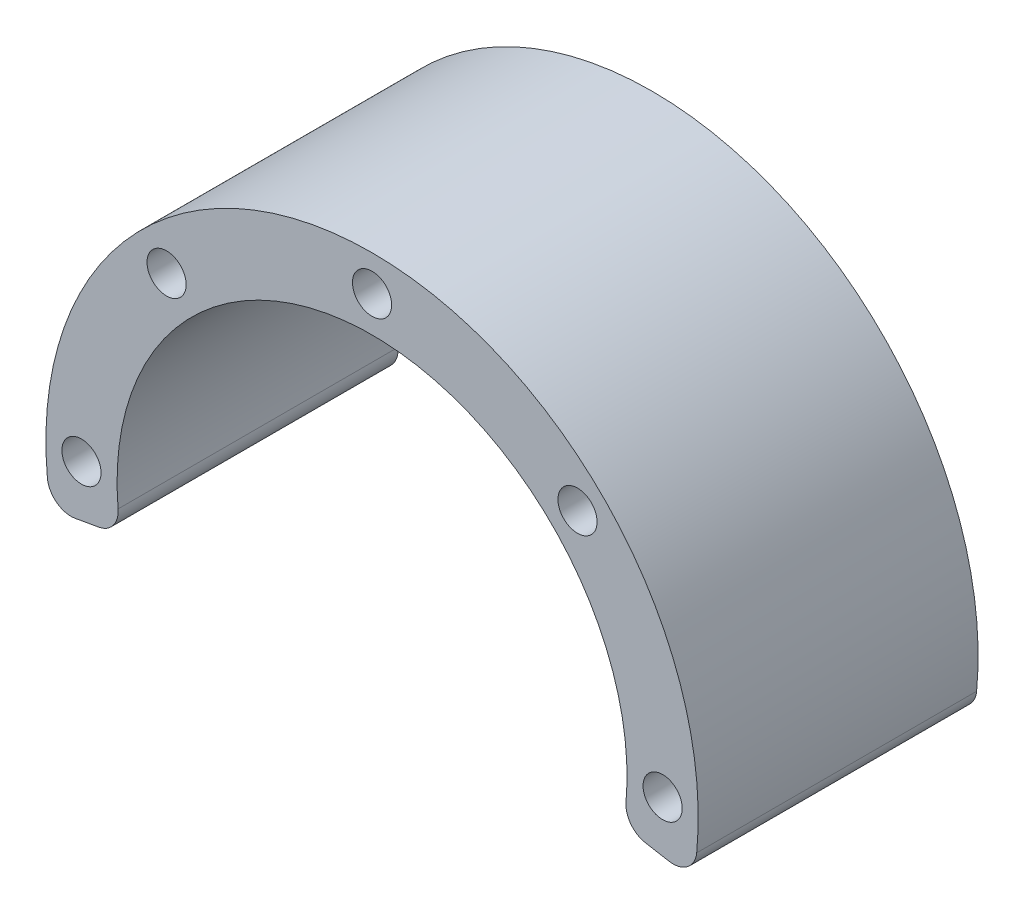
ISO-10303-21;
HEADER;
FILE_DESCRIPTION(('STEP AP214'),'2;1');
FILE_NAME('part.step','',(''),(''),'','','');
FILE_SCHEMA(('AUTOMOTIVE_DESIGN { 1 0 10303 214 1 1 1 1 }'));
ENDSEC;
DATA;
#1=APPLICATION_CONTEXT('core data for automotive mechanical design processes');
#2=APPLICATION_PROTOCOL_DEFINITION('international standard','automotive_design',2000,#1);
#3=PRODUCT_CONTEXT('',#1,'mechanical');
#4=PRODUCT('Part','Part','',(#3));
#5=PRODUCT_RELATED_PRODUCT_CATEGORY('part','',(#4));
#6=PRODUCT_DEFINITION_FORMATION('','',#4);
#7=PRODUCT_DEFINITION_CONTEXT('part definition',#1,'design');
#8=PRODUCT_DEFINITION('design','',#6,#7);
#9=PRODUCT_DEFINITION_SHAPE('','',#8);
#10=(LENGTH_UNIT() NAMED_UNIT(*) SI_UNIT(.MILLI.,.METRE.));
#11=(NAMED_UNIT(*) PLANE_ANGLE_UNIT() SI_UNIT($,.RADIAN.));
#12=(NAMED_UNIT(*) SI_UNIT($,.STERADIAN.) SOLID_ANGLE_UNIT());
#13=UNCERTAINTY_MEASURE_WITH_UNIT(LENGTH_MEASURE(1.E-05),#10,'distance_accuracy_value','');
#14=(GEOMETRIC_REPRESENTATION_CONTEXT(3) GLOBAL_UNCERTAINTY_ASSIGNED_CONTEXT((#13)) GLOBAL_UNIT_ASSIGNED_CONTEXT((#10,
#11,#12)) REPRESENTATION_CONTEXT('',''));
#15=CARTESIAN_POINT('',(0.,0.,0.));
#16=DIRECTION('',(0.,0.,1.));
#17=DIRECTION('',(1.,0.,0.));
#18=AXIS2_PLACEMENT_3D('',#15,#16,#17);
#19=CARTESIAN_POINT('',(0.,0.,0.));
#20=DIRECTION('',(0.,0.,1.));
#21=DIRECTION('',(1.,0.,0.));
#22=AXIS2_PLACEMENT_3D('',#19,#20,#21);
#23=PLANE('',#22);
#24=CARTESIAN_POINT('',(0.,24.5,0.));
#25=DIRECTION('',(0.,0.,1.));
#26=DIRECTION('',(1.,0.,0.));
#27=AXIS2_PLACEMENT_3D('',#24,#25,#26);
#28=CIRCLE('',#27,1.65);
#29=CARTESIAN_POINT('',(1.65,24.5,0.));
#30=VERTEX_POINT('',#29);
#31=EDGE_CURVE('E178',#30,#30,#28,.T.);
#32=ORIENTED_EDGE('',*,*,#31,.T.);
#33=EDGE_LOOP('',(#32));
#34=FACE_BOUND('',#33,.T.);
#35=CARTESIAN_POINT('',(17.3241161390707,17.3241161390701,0.));
#36=DIRECTION('',(0.,0.,1.));
#37=DIRECTION('',(1.,0.,0.));
#38=AXIS2_PLACEMENT_3D('',#35,#36,#37);
#39=CIRCLE('',#38,1.65);
#40=CARTESIAN_POINT('',(18.9741161390707,17.3241161390701,0.));
#41=VERTEX_POINT('',#40);
#42=EDGE_CURVE('E183',#41,#41,#39,.T.);
#43=ORIENTED_EDGE('',*,*,#42,.T.);
#44=EDGE_LOOP('',(#43));
#45=FACE_BOUND('',#44,.T.);
#46=CARTESIAN_POINT('',(24.5,-4.31946145518225E-13,0.));
#47=DIRECTION('',(0.,0.,1.));
#48=DIRECTION('',(1.,0.,0.));
#49=AXIS2_PLACEMENT_3D('',#46,#47,#48);
#50=CIRCLE('',#49,1.65);
#51=CARTESIAN_POINT('',(26.15,-4.31946145518225E-13,0.));
#52=VERTEX_POINT('',#51);
#53=EDGE_CURVE('E187',#52,#52,#50,.T.);
#54=ORIENTED_EDGE('',*,*,#53,.T.);
#55=EDGE_LOOP('',(#54));
#56=FACE_BOUND('',#55,.T.);
#57=CARTESIAN_POINT('',(-24.5,0.,0.));
#58=DIRECTION('',(0.,0.,1.));
#59=DIRECTION('',(1.,0.,0.));
#60=AXIS2_PLACEMENT_3D('',#57,#58,#59);
#61=CIRCLE('',#60,1.65);
#62=CARTESIAN_POINT('',(-22.85,0.,0.));
#63=VERTEX_POINT('',#62);
#64=EDGE_CURVE('E191',#63,#63,#61,.T.);
#65=ORIENTED_EDGE('',*,*,#64,.T.);
#66=EDGE_LOOP('',(#65));
#67=FACE_BOUND('',#66,.T.);
#68=CARTESIAN_POINT('',(-17.3241161390702,17.3241161390706,0.));
#69=DIRECTION('',(0.,0.,1.));
#70=DIRECTION('',(1.,0.,0.));
#71=AXIS2_PLACEMENT_3D('',#68,#69,#70);
#72=CIRCLE('',#71,1.65);
#73=CARTESIAN_POINT('',(-15.6741161390702,17.3241161390706,0.));
#74=VERTEX_POINT('',#73);
#75=EDGE_CURVE('E195',#74,#74,#72,.T.);
#76=ORIENTED_EDGE('',*,*,#75,.T.);
#77=EDGE_LOOP('',(#76));
#78=FACE_BOUND('',#77,.T.);
#79=CARTESIAN_POINT('',(0.,0.,0.));
#80=DIRECTION('',(0.,0.,1.));
#81=DIRECTION('',(1.,0.,0.));
#82=AXIS2_PLACEMENT_3D('',#79,#80,#81);
#83=CIRCLE('',#82,27.5);
#84=CARTESIAN_POINT('',(27.3733221470456,-2.63651941659133,0.));
#85=VERTEX_POINT('',#84);
#86=CARTESIAN_POINT('',(-27.3733221470456,-2.63651941659133,0.));
#87=VERTEX_POINT('',#86);
#88=EDGE_CURVE('E182',#85,#87,#83,.T.);
#89=ORIENTED_EDGE('',*,*,#88,.F.);
#90=CARTESIAN_POINT('',(25.3825350818059,-2.44477254993014,0.));
#91=DIRECTION('',(0.,0.,1.));
#92=DIRECTION('',(1.,0.,0.));
#93=AXIS2_PLACEMENT_3D('',#90,#91,#92);
#94=CIRCLE('',#93,2.);
#95=CARTESIAN_POINT('',(25.0352387264721,-4.41438805595456,0.));
#96=VERTEX_POINT('',#95);
#97=EDGE_CURVE('E225',#85,#96,#94,.F.);
#98=ORIENTED_EDGE('',*,*,#97,.T.);
#99=DIRECTION('',(-0.984807753012207,0.173648177666934,0.));
#100=VECTOR('',#99,1.);
#101=CARTESIAN_POINT('',(21.1733666897625,-3.73343581983909,0.));
#102=LINE('',#101,#100);
#103=CARTESIAN_POINT('',(23.0590164506845,-4.06592674885611,0.));
#104=VERTEX_POINT('',#103);
#105=EDGE_CURVE('E132',#96,#104,#102,.T.);
#106=ORIENTED_EDGE('',*,*,#105,.T.);
#107=CARTESIAN_POINT('',(23.4063128060183,-2.0963112428317,0.));
#108=DIRECTION('',(0.,0.,1.));
#109=DIRECTION('',(1.,0.,0.));
#110=AXIS2_PLACEMENT_3D('',#107,#108,#109);
#111=CIRCLE('',#110,2.);
#112=CARTESIAN_POINT('',(21.4142861842295,-1.91790177535666,0.));
#113=VERTEX_POINT('',#112);
#114=EDGE_CURVE('E217',#104,#113,#111,.F.);
#115=ORIENTED_EDGE('',*,*,#114,.T.);
#116=CARTESIAN_POINT('',(0.,0.,0.));
#117=DIRECTION('',(0.,0.,1.));
#118=DIRECTION('',(1.,0.,0.));
#119=AXIS2_PLACEMENT_3D('',#116,#117,#118);
#120=CIRCLE('',#119,21.5);
#121=CARTESIAN_POINT('',(-21.4142861842295,-1.91790177535666,0.));
#122=VERTEX_POINT('',#121);
#123=EDGE_CURVE('E177',#113,#122,#120,.T.);
#124=ORIENTED_EDGE('',*,*,#123,.T.);
#125=CARTESIAN_POINT('',(-23.4063128060183,-2.0963112428317,0.));
#126=DIRECTION('',(0.,0.,1.));
#127=DIRECTION('',(1.,0.,0.));
#128=AXIS2_PLACEMENT_3D('',#125,#126,#127);
#129=CIRCLE('',#128,2.);
#130=CARTESIAN_POINT('',(-23.0590164506845,-4.06592674885611,0.));
#131=VERTEX_POINT('',#130);
#132=EDGE_CURVE('E67',#122,#131,#129,.F.);
#133=ORIENTED_EDGE('',*,*,#132,.T.);
#134=DIRECTION('',(-0.984807753012207,-0.173648177666934,0.));
#135=VECTOR('',#134,1.);
#136=CARTESIAN_POINT('',(-21.1733666897625,-3.73343581983909,0.));
#137=LINE('',#136,#135);
#138=CARTESIAN_POINT('',(-25.0352387264721,-4.41438805595456,0.));
#139=VERTEX_POINT('',#138);
#140=EDGE_CURVE('E148',#131,#139,#137,.T.);
#141=ORIENTED_EDGE('',*,*,#140,.T.);
#142=CARTESIAN_POINT('',(-25.3825350818059,-2.44477254993014,0.));
#143=DIRECTION('',(0.,0.,1.));
#144=DIRECTION('',(1.,0.,0.));
#145=AXIS2_PLACEMENT_3D('',#142,#143,#144);
#146=CIRCLE('',#145,2.);
#147=EDGE_CURVE('E222',#139,#87,#146,.F.);
#148=ORIENTED_EDGE('',*,*,#147,.T.);
#149=EDGE_LOOP('',(#89,#98,#106,#115,#124,#133,#141,#148));
#150=FACE_BOUND('',#149,.T.);
#151=ADVANCED_FACE('F44',(#34,#45,#56,#67,#78,#150),#23,.F.);
#152=CARTESIAN_POINT('',(0.,0.,2.));
#153=DIRECTION('',(0.,0.,-1.));
#154=DIRECTION('',(-1.,0.,0.));
#155=AXIS2_PLACEMENT_3D('',#152,#153,#154);
#156=CYLINDRICAL_SURFACE('',#155,27.5);
#157=CARTESIAN_POINT('',(0.,0.,23.6));
#158=DIRECTION('',(0.,0.,-1.));
#159=DIRECTION('',(-1.,0.,0.));
#160=AXIS2_PLACEMENT_3D('',#157,#158,#159);
#161=CIRCLE('',#160,27.5);
#162=CARTESIAN_POINT('',(-27.3733221470456,-2.63651941659133,23.6));
#163=VERTEX_POINT('',#162);
#164=CARTESIAN_POINT('',(27.3733221470456,-2.63651941659133,23.6));
#165=VERTEX_POINT('',#164);
#166=EDGE_CURVE('E174',#163,#165,#161,.T.);
#167=ORIENTED_EDGE('',*,*,#166,.T.);
#168=DIRECTION('',(0.,0.,-1.));
#169=VECTOR('',#168,1.);
#170=CARTESIAN_POINT('',(27.3733221470456,-2.63651941659133,2.));
#171=LINE('',#170,#169);
#172=EDGE_CURVE('E116',#165,#85,#171,.T.);
#173=ORIENTED_EDGE('',*,*,#172,.T.);
#174=ORIENTED_EDGE('',*,*,#88,.T.);
#175=DIRECTION('',(0.,0.,-1.));
#176=VECTOR('',#175,1.);
#177=CARTESIAN_POINT('',(-27.3733221470456,-2.63651941659133,2.));
#178=LINE('',#177,#176);
#179=EDGE_CURVE('E122',#87,#163,#178,.F.);
#180=ORIENTED_EDGE('',*,*,#179,.T.);
#181=EDGE_LOOP('',(#167,#173,#174,#180));
#182=FACE_BOUND('',#181,.T.);
#183=ADVANCED_FACE('F257',(#182),#156,.T.);
#184=CARTESIAN_POINT('',(-17.3241161390702,17.3241161390706,0.));
#185=DIRECTION('',(0.,0.,1.));
#186=DIRECTION('',(1.,0.,0.));
#187=AXIS2_PLACEMENT_3D('',#184,#185,#186);
#188=CYLINDRICAL_SURFACE('',#187,1.65);
#189=ORIENTED_EDGE('',*,*,#75,.F.);
#190=EDGE_LOOP('',(#189));
#191=FACE_BOUND('',#190,.T.);
#192=CARTESIAN_POINT('',(-17.3241161390702,17.3241161390706,23.6));
#193=DIRECTION('',(0.,0.,-1.));
#194=DIRECTION('',(-1.,0.,0.));
#195=AXIS2_PLACEMENT_3D('',#192,#193,#194);
#196=CIRCLE('',#195,1.65);
#197=CARTESIAN_POINT('',(-18.9741161390702,17.3241161390706,23.6));
#198=VERTEX_POINT('',#197);
#199=EDGE_CURVE('E166',#198,#198,#196,.T.);
#200=ORIENTED_EDGE('',*,*,#199,.F.);
#201=EDGE_LOOP('',(#200));
#202=FACE_BOUND('',#201,.T.);
#203=ADVANCED_FACE('F263',(#191,#202),#188,.F.);
#204=CARTESIAN_POINT('',(-24.5,0.,0.));
#205=DIRECTION('',(0.,0.,1.));
#206=DIRECTION('',(1.,0.,0.));
#207=AXIS2_PLACEMENT_3D('',#204,#205,#206);
#208=CYLINDRICAL_SURFACE('',#207,1.65);
#209=ORIENTED_EDGE('',*,*,#64,.F.);
#210=EDGE_LOOP('',(#209));
#211=FACE_BOUND('',#210,.T.);
#212=CARTESIAN_POINT('',(-24.5,0.,23.6));
#213=DIRECTION('',(0.,0.,-1.));
#214=DIRECTION('',(-1.,0.,0.));
#215=AXIS2_PLACEMENT_3D('',#212,#213,#214);
#216=CIRCLE('',#215,1.65);
#217=CARTESIAN_POINT('',(-26.15,0.,23.6));
#218=VERTEX_POINT('',#217);
#219=EDGE_CURVE('E162',#218,#218,#216,.T.);
#220=ORIENTED_EDGE('',*,*,#219,.F.);
#221=EDGE_LOOP('',(#220));
#222=FACE_BOUND('',#221,.T.);
#223=ADVANCED_FACE('F374',(#211,#222),#208,.F.);
#224=CARTESIAN_POINT('',(24.5,-4.31946145518225E-13,0.));
#225=DIRECTION('',(0.,0.,1.));
#226=DIRECTION('',(1.,0.,0.));
#227=AXIS2_PLACEMENT_3D('',#224,#225,#226);
#228=CYLINDRICAL_SURFACE('',#227,1.65);
#229=ORIENTED_EDGE('',*,*,#53,.F.);
#230=EDGE_LOOP('',(#229));
#231=FACE_BOUND('',#230,.T.);
#232=CARTESIAN_POINT('',(24.5,-4.31946145518225E-13,23.6));
#233=DIRECTION('',(0.,0.,-1.));
#234=DIRECTION('',(-1.,0.,0.));
#235=AXIS2_PLACEMENT_3D('',#232,#233,#234);
#236=CIRCLE('',#235,1.65);
#237=CARTESIAN_POINT('',(22.85,-4.31946145518225E-13,23.6));
#238=VERTEX_POINT('',#237);
#239=EDGE_CURVE('E158',#238,#238,#236,.T.);
#240=ORIENTED_EDGE('',*,*,#239,.F.);
#241=EDGE_LOOP('',(#240));
#242=FACE_BOUND('',#241,.T.);
#243=ADVANCED_FACE('F361',(#231,#242),#228,.F.);
#244=CARTESIAN_POINT('',(17.3241161390707,17.3241161390701,0.));
#245=DIRECTION('',(0.,0.,1.));
#246=DIRECTION('',(1.,0.,0.));
#247=AXIS2_PLACEMENT_3D('',#244,#245,#246);
#248=CYLINDRICAL_SURFACE('',#247,1.65);
#249=ORIENTED_EDGE('',*,*,#42,.F.);
#250=EDGE_LOOP('',(#249));
#251=FACE_BOUND('',#250,.T.);
#252=CARTESIAN_POINT('',(17.3241161390707,17.3241161390701,23.6));
#253=DIRECTION('',(0.,0.,-1.));
#254=DIRECTION('',(-1.,0.,0.));
#255=AXIS2_PLACEMENT_3D('',#252,#253,#254);
#256=CIRCLE('',#255,1.65);
#257=CARTESIAN_POINT('',(15.6741161390707,17.3241161390701,23.6));
#258=VERTEX_POINT('',#257);
#259=EDGE_CURVE('E151',#258,#258,#256,.T.);
#260=ORIENTED_EDGE('',*,*,#259,.F.);
#261=EDGE_LOOP('',(#260));
#262=FACE_BOUND('',#261,.T.);
#263=ADVANCED_FACE('F347',(#251,#262),#248,.F.);
#264=CARTESIAN_POINT('',(0.,24.5,0.));
#265=DIRECTION('',(0.,0.,1.));
#266=DIRECTION('',(1.,0.,0.));
#267=AXIS2_PLACEMENT_3D('',#264,#265,#266);
#268=CYLINDRICAL_SURFACE('',#267,1.65);
#269=ORIENTED_EDGE('',*,*,#31,.F.);
#270=EDGE_LOOP('',(#269));
#271=FACE_BOUND('',#270,.T.);
#272=CARTESIAN_POINT('',(0.,24.5,23.6));
#273=DIRECTION('',(0.,0.,-1.));
#274=DIRECTION('',(-1.,0.,0.));
#275=AXIS2_PLACEMENT_3D('',#272,#273,#274);
#276=CIRCLE('',#275,1.65);
#277=CARTESIAN_POINT('',(-1.65,24.5,23.6));
#278=VERTEX_POINT('',#277);
#279=EDGE_CURVE('E170',#278,#278,#276,.T.);
#280=ORIENTED_EDGE('',*,*,#279,.F.);
#281=EDGE_LOOP('',(#280));
#282=FACE_BOUND('',#281,.T.);
#283=ADVANCED_FACE('F333',(#271,#282),#268,.F.);
#284=CARTESIAN_POINT('',(0.,0.,-8.));
#285=DIRECTION('',(0.,0.,1.));
#286=DIRECTION('',(1.,0.,0.));
#287=AXIS2_PLACEMENT_3D('',#284,#285,#286);
#288=CYLINDRICAL_SURFACE('',#287,21.5);
#289=CARTESIAN_POINT('',(0.,0.,23.6));
#290=DIRECTION('',(0.,0.,-1.));
#291=DIRECTION('',(-1.,0.,0.));
#292=AXIS2_PLACEMENT_3D('',#289,#290,#291);
#293=CIRCLE('',#292,21.5);
#294=CARTESIAN_POINT('',(-21.4142861842295,-1.91790177535666,23.6));
#295=VERTEX_POINT('',#294);
#296=CARTESIAN_POINT('',(21.4142861842295,-1.91790177535666,23.6));
#297=VERTEX_POINT('',#296);
#298=EDGE_CURVE('E155',#295,#297,#293,.T.);
#299=ORIENTED_EDGE('',*,*,#298,.F.);
#300=DIRECTION('',(0.,0.,1.));
#301=VECTOR('',#300,1.);
#302=CARTESIAN_POINT('',(-21.4142861842295,-1.91790177535666,-8.));
#303=LINE('',#302,#301);
#304=EDGE_CURVE('E11',#295,#122,#303,.F.);
#305=ORIENTED_EDGE('',*,*,#304,.T.);
#306=ORIENTED_EDGE('',*,*,#123,.F.);
#307=DIRECTION('',(0.,0.,1.));
#308=VECTOR('',#307,1.);
#309=CARTESIAN_POINT('',(21.4142861842295,-1.91790177535666,-8.));
#310=LINE('',#309,#308);
#311=EDGE_CURVE('E53',#113,#297,#310,.T.);
#312=ORIENTED_EDGE('',*,*,#311,.T.);
#313=EDGE_LOOP('',(#299,#305,#306,#312));
#314=FACE_BOUND('',#313,.T.);
#315=ADVANCED_FACE('F238',(#314),#288,.F.);
#316=CARTESIAN_POINT('',(0.,0.,23.6));
#317=DIRECTION('',(0.,0.,-1.));
#318=DIRECTION('',(-1.,0.,0.));
#319=AXIS2_PLACEMENT_3D('',#316,#317,#318);
#320=PLANE('',#319);
#321=ORIENTED_EDGE('',*,*,#259,.T.);
#322=EDGE_LOOP('',(#321));
#323=FACE_BOUND('',#322,.T.);
#324=DIRECTION('',(-0.984807753012207,0.173648177666934,0.));
#325=VECTOR('',#324,1.);
#326=CARTESIAN_POINT('',(21.1733666897625,-3.73343581983909,23.6));
#327=LINE('',#326,#325);
#328=CARTESIAN_POINT('',(25.0352387264721,-4.41438805595456,23.6));
#329=VERTEX_POINT('',#328);
#330=CARTESIAN_POINT('',(23.0590164506845,-4.06592674885611,23.6));
#331=VERTEX_POINT('',#330);
#332=EDGE_CURVE('E129',#329,#331,#327,.T.);
#333=ORIENTED_EDGE('',*,*,#332,.F.);
#334=CARTESIAN_POINT('',(25.3825350818059,-2.44477254993014,23.6));
#335=DIRECTION('',(0.,0.,-1.));
#336=DIRECTION('',(-1.,0.,0.));
#337=AXIS2_PLACEMENT_3D('',#334,#335,#336);
#338=CIRCLE('',#337,2.);
#339=EDGE_CURVE('E111',#329,#165,#338,.F.);
#340=ORIENTED_EDGE('',*,*,#339,.T.);
#341=ORIENTED_EDGE('',*,*,#166,.F.);
#342=CARTESIAN_POINT('',(-25.3825350818059,-2.44477254993014,23.6));
#343=DIRECTION('',(0.,0.,-1.));
#344=DIRECTION('',(-1.,0.,0.));
#345=AXIS2_PLACEMENT_3D('',#342,#343,#344);
#346=CIRCLE('',#345,2.);
#347=CARTESIAN_POINT('',(-25.0352387264721,-4.41438805595456,23.6));
#348=VERTEX_POINT('',#347);
#349=EDGE_CURVE('E123',#163,#348,#346,.F.);
#350=ORIENTED_EDGE('',*,*,#349,.T.);
#351=DIRECTION('',(-0.984807753012207,-0.173648177666934,0.));
#352=VECTOR('',#351,1.);
#353=CARTESIAN_POINT('',(-21.1733666897625,-3.73343581983909,23.6));
#354=LINE('',#353,#352);
#355=CARTESIAN_POINT('',(-23.0590164506845,-4.06592674885611,23.6));
#356=VERTEX_POINT('',#355);
#357=EDGE_CURVE('E141',#356,#348,#354,.T.);
#358=ORIENTED_EDGE('',*,*,#357,.F.);
#359=CARTESIAN_POINT('',(-23.4063128060183,-2.0963112428317,23.6));
#360=DIRECTION('',(0.,0.,-1.));
#361=DIRECTION('',(-1.,0.,0.));
#362=AXIS2_PLACEMENT_3D('',#359,#360,#361);
#363=CIRCLE('',#362,2.);
#364=EDGE_CURVE('E207',#356,#295,#363,.F.);
#365=ORIENTED_EDGE('',*,*,#364,.T.);
#366=ORIENTED_EDGE('',*,*,#298,.T.);
#367=CARTESIAN_POINT('',(23.4063128060183,-2.0963112428317,23.6));
#368=DIRECTION('',(0.,0.,-1.));
#369=DIRECTION('',(-1.,0.,0.));
#370=AXIS2_PLACEMENT_3D('',#367,#368,#369);
#371=CIRCLE('',#370,2.);
#372=EDGE_CURVE('E134',#297,#331,#371,.F.);
#373=ORIENTED_EDGE('',*,*,#372,.T.);
#374=EDGE_LOOP('',(#333,#340,#341,#350,#358,#365,#366,#373));
#375=FACE_BOUND('',#374,.T.);
#376=ORIENTED_EDGE('',*,*,#239,.T.);
#377=EDGE_LOOP('',(#376));
#378=FACE_BOUND('',#377,.T.);
#379=ORIENTED_EDGE('',*,*,#219,.T.);
#380=EDGE_LOOP('',(#379));
#381=FACE_BOUND('',#380,.T.);
#382=ORIENTED_EDGE('',*,*,#199,.T.);
#383=EDGE_LOOP('',(#382));
#384=FACE_BOUND('',#383,.T.);
#385=ORIENTED_EDGE('',*,*,#279,.T.);
#386=EDGE_LOOP('',(#385));
#387=FACE_BOUND('',#386,.T.);
#388=ADVANCED_FACE('F137',(#323,#375,#378,#381,#384,#387),#320,.F.);
#389=CARTESIAN_POINT('',(21.1733666897625,-3.73343581983909,0.));
#390=DIRECTION('',(0.173648177666934,0.984807753012207,0.));
#391=DIRECTION('',(-0.984807753012208,0.173648177666934,0.));
#392=AXIS2_PLACEMENT_3D('',#389,#390,#391);
#393=PLANE('',#392);
#394=ORIENTED_EDGE('',*,*,#105,.F.);
#395=DIRECTION('',(0.,0.,-1.));
#396=VECTOR('',#395,1.);
#397=CARTESIAN_POINT('',(25.0352387264721,-4.41438805595456,0.));
#398=LINE('',#397,#396);
#399=EDGE_CURVE('E115',#96,#329,#398,.F.);
#400=ORIENTED_EDGE('',*,*,#399,.T.);
#401=ORIENTED_EDGE('',*,*,#332,.T.);
#402=DIRECTION('',(0.,0.,1.));
#403=VECTOR('',#402,1.);
#404=CARTESIAN_POINT('',(23.0590164506845,-4.06592674885611,0.));
#405=LINE('',#404,#403);
#406=EDGE_CURVE('E135',#331,#104,#405,.F.);
#407=ORIENTED_EDGE('',*,*,#406,.T.);
#408=EDGE_LOOP('',(#394,#400,#401,#407));
#409=FACE_BOUND('',#408,.T.);
#410=ADVANCED_FACE('F128',(#409),#393,.F.);
#411=CARTESIAN_POINT('',(-21.1733666897625,-3.73343581983909,0.));
#412=DIRECTION('',(-0.173648177666934,0.984807753012207,0.));
#413=DIRECTION('',(-0.984807753012208,-0.173648177666934,0.));
#414=AXIS2_PLACEMENT_3D('',#411,#412,#413);
#415=PLANE('',#414);
#416=ORIENTED_EDGE('',*,*,#357,.T.);
#417=DIRECTION('',(0.,0.,-1.));
#418=VECTOR('',#417,1.);
#419=CARTESIAN_POINT('',(-25.0352387264721,-4.41438805595456,0.));
#420=LINE('',#419,#418);
#421=EDGE_CURVE('E60',#348,#139,#420,.T.);
#422=ORIENTED_EDGE('',*,*,#421,.T.);
#423=ORIENTED_EDGE('',*,*,#140,.F.);
#424=DIRECTION('',(0.,0.,1.));
#425=VECTOR('',#424,1.);
#426=CARTESIAN_POINT('',(-23.0590164506845,-4.06592674885611,0.));
#427=LINE('',#426,#425);
#428=EDGE_CURVE('E227',#131,#356,#427,.T.);
#429=ORIENTED_EDGE('',*,*,#428,.T.);
#430=EDGE_LOOP('',(#416,#422,#423,#429));
#431=FACE_BOUND('',#430,.T.);
#432=ADVANCED_FACE('F246',(#431),#415,.F.);
#433=CARTESIAN_POINT('',(25.3825350818059,-2.44477254993014,2.));
#434=DIRECTION('',(0.,0.,-1.));
#435=DIRECTION('',(-1.,0.,0.));
#436=AXIS2_PLACEMENT_3D('',#433,#434,#435);
#437=CYLINDRICAL_SURFACE('',#436,2.);
#438=ORIENTED_EDGE('',*,*,#97,.F.);
#439=ORIENTED_EDGE('',*,*,#172,.F.);
#440=ORIENTED_EDGE('',*,*,#339,.F.);
#441=ORIENTED_EDGE('',*,*,#399,.F.);
#442=EDGE_LOOP('',(#438,#439,#440,#441));
#443=FACE_BOUND('',#442,.T.);
#444=ADVANCED_FACE('F114',(#443),#437,.T.);
#445=CARTESIAN_POINT('',(-25.3825350818059,-2.44477254993014,2.));
#446=DIRECTION('',(0.,0.,-1.));
#447=DIRECTION('',(-1.,0.,0.));
#448=AXIS2_PLACEMENT_3D('',#445,#446,#447);
#449=CYLINDRICAL_SURFACE('',#448,2.);
#450=ORIENTED_EDGE('',*,*,#147,.F.);
#451=ORIENTED_EDGE('',*,*,#421,.F.);
#452=ORIENTED_EDGE('',*,*,#349,.F.);
#453=ORIENTED_EDGE('',*,*,#179,.F.);
#454=EDGE_LOOP('',(#450,#451,#452,#453));
#455=FACE_BOUND('',#454,.T.);
#456=ADVANCED_FACE('F255',(#455),#449,.T.);
#457=CARTESIAN_POINT('',(-23.4063128060183,-2.0963112428317,-8.));
#458=DIRECTION('',(0.,0.,1.));
#459=DIRECTION('',(1.,0.,0.));
#460=AXIS2_PLACEMENT_3D('',#457,#458,#459);
#461=CYLINDRICAL_SURFACE('',#460,2.);
#462=ORIENTED_EDGE('',*,*,#132,.F.);
#463=ORIENTED_EDGE('',*,*,#304,.F.);
#464=ORIENTED_EDGE('',*,*,#364,.F.);
#465=ORIENTED_EDGE('',*,*,#428,.F.);
#466=EDGE_LOOP('',(#462,#463,#464,#465));
#467=FACE_BOUND('',#466,.T.);
#468=ADVANCED_FACE('F245',(#467),#461,.T.);
#469=CARTESIAN_POINT('',(23.4063128060183,-2.0963112428317,-8.));
#470=DIRECTION('',(0.,0.,1.));
#471=DIRECTION('',(1.,0.,0.));
#472=AXIS2_PLACEMENT_3D('',#469,#470,#471);
#473=CYLINDRICAL_SURFACE('',#472,2.);
#474=ORIENTED_EDGE('',*,*,#114,.F.);
#475=ORIENTED_EDGE('',*,*,#406,.F.);
#476=ORIENTED_EDGE('',*,*,#372,.F.);
#477=ORIENTED_EDGE('',*,*,#311,.F.);
#478=EDGE_LOOP('',(#474,#475,#476,#477));
#479=FACE_BOUND('',#478,.T.);
#480=ADVANCED_FACE('F46',(#479),#473,.T.);
#481=CLOSED_SHELL('',(#151,#183,#203,#223,#243,#263,#283,#315,#388,#410,#432,#444,#456,#468,#480));
#482=MANIFOLD_SOLID_BREP('B2',#481);
#483=ADVANCED_BREP_SHAPE_REPRESENTATION('',(#18,#482),#14);
#484=SHAPE_DEFINITION_REPRESENTATION(#9,#483);
ENDSEC;
END-ISO-10303-21;
